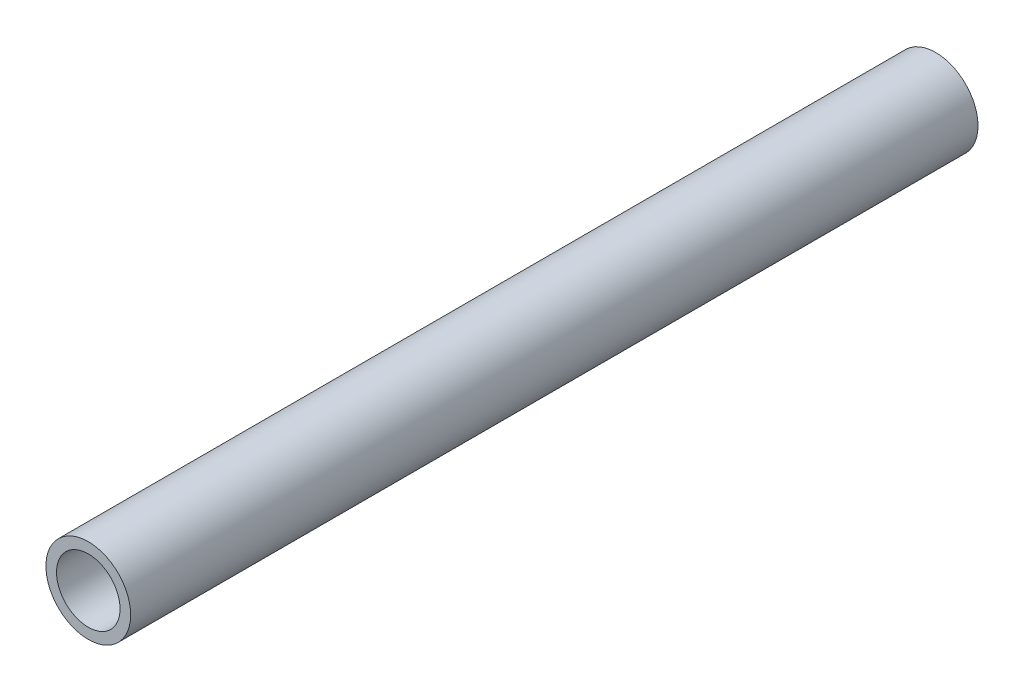
ISO-10303-21;
HEADER;
FILE_DESCRIPTION(('STEP AP214'),'2;1');
FILE_NAME('part.step','',(''),(''),'','','');
FILE_SCHEMA(('AUTOMOTIVE_DESIGN { 1 0 10303 214 1 1 1 1 }'));
ENDSEC;
DATA;
#1=APPLICATION_CONTEXT('core data for automotive mechanical design processes');
#2=APPLICATION_PROTOCOL_DEFINITION('international standard','automotive_design',2000,#1);
#3=PRODUCT_CONTEXT('',#1,'mechanical');
#4=PRODUCT('Part','Part','',(#3));
#5=PRODUCT_RELATED_PRODUCT_CATEGORY('part','',(#4));
#6=PRODUCT_DEFINITION_FORMATION('','',#4);
#7=PRODUCT_DEFINITION_CONTEXT('part definition',#1,'design');
#8=PRODUCT_DEFINITION('design','',#6,#7);
#9=PRODUCT_DEFINITION_SHAPE('','',#8);
#10=(LENGTH_UNIT() NAMED_UNIT(*) SI_UNIT(.MILLI.,.METRE.));
#11=(NAMED_UNIT(*) PLANE_ANGLE_UNIT() SI_UNIT($,.RADIAN.));
#12=(NAMED_UNIT(*) SI_UNIT($,.STERADIAN.) SOLID_ANGLE_UNIT());
#13=UNCERTAINTY_MEASURE_WITH_UNIT(LENGTH_MEASURE(1.E-05),#10,'distance_accuracy_value','');
#14=(GEOMETRIC_REPRESENTATION_CONTEXT(3) GLOBAL_UNCERTAINTY_ASSIGNED_CONTEXT((#13)) GLOBAL_UNIT_ASSIGNED_CONTEXT((#10,
#11,#12)) REPRESENTATION_CONTEXT('',''));
#15=CARTESIAN_POINT('',(0.,0.,0.));
#16=DIRECTION('',(0.,0.,1.));
#17=DIRECTION('',(1.,0.,0.));
#18=AXIS2_PLACEMENT_3D('',#15,#16,#17);
#19=CARTESIAN_POINT('',(0.,0.,160.));
#20=DIRECTION('',(0.,0.,1.));
#21=DIRECTION('',(1.,0.,0.));
#22=AXIS2_PLACEMENT_3D('',#19,#20,#21);
#23=PLANE('',#22);
#24=CARTESIAN_POINT('',(0.,0.,160.));
#25=DIRECTION('',(0.,0.,1.));
#26=DIRECTION('',(1.,0.,0.));
#27=AXIS2_PLACEMENT_3D('',#24,#25,#26);
#28=CIRCLE('',#27,8.);
#29=CARTESIAN_POINT('',(8.,0.,160.));
#30=VERTEX_POINT('',#29);
#31=EDGE_CURVE('E10',#30,#30,#28,.T.);
#32=ORIENTED_EDGE('',*,*,#31,.T.);
#33=EDGE_LOOP('',(#32));
#34=FACE_BOUND('',#33,.T.);
#35=CARTESIAN_POINT('',(0.,0.,160.));
#36=DIRECTION('',(0.,0.,1.));
#37=DIRECTION('',(1.,0.,0.));
#38=AXIS2_PLACEMENT_3D('',#35,#36,#37);
#39=CIRCLE('',#38,6.);
#40=CARTESIAN_POINT('',(6.,0.,160.));
#41=VERTEX_POINT('',#40);
#42=EDGE_CURVE('E47',#41,#41,#39,.T.);
#43=ORIENTED_EDGE('',*,*,#42,.F.);
#44=EDGE_LOOP('',(#43));
#45=FACE_BOUND('',#44,.T.);
#46=ADVANCED_FACE('F36',(#34,#45),#23,.T.);
#47=CARTESIAN_POINT('',(0.,0.,0.));
#48=DIRECTION('',(0.,0.,1.));
#49=DIRECTION('',(1.,0.,0.));
#50=AXIS2_PLACEMENT_3D('',#47,#48,#49);
#51=PLANE('',#50);
#52=CARTESIAN_POINT('',(0.,0.,0.));
#53=DIRECTION('',(0.,0.,1.));
#54=DIRECTION('',(1.,0.,0.));
#55=AXIS2_PLACEMENT_3D('',#52,#53,#54);
#56=CIRCLE('',#55,8.);
#57=CARTESIAN_POINT('',(8.,0.,0.));
#58=VERTEX_POINT('',#57);
#59=EDGE_CURVE('E40',#58,#58,#56,.T.);
#60=ORIENTED_EDGE('',*,*,#59,.F.);
#61=EDGE_LOOP('',(#60));
#62=FACE_BOUND('',#61,.T.);
#63=CARTESIAN_POINT('',(0.,0.,0.));
#64=DIRECTION('',(0.,0.,1.));
#65=DIRECTION('',(1.,0.,0.));
#66=AXIS2_PLACEMENT_3D('',#63,#64,#65);
#67=CIRCLE('',#66,6.);
#68=CARTESIAN_POINT('',(6.,0.,0.));
#69=VERTEX_POINT('',#68);
#70=EDGE_CURVE('E49',#69,#69,#67,.T.);
#71=ORIENTED_EDGE('',*,*,#70,.T.);
#72=EDGE_LOOP('',(#71));
#73=FACE_BOUND('',#72,.T.);
#74=ADVANCED_FACE('F59',(#62,#73),#51,.F.);
#75=CARTESIAN_POINT('',(0.,0.,160.));
#76=DIRECTION('',(0.,0.,-1.));
#77=DIRECTION('',(-1.,0.,0.));
#78=AXIS2_PLACEMENT_3D('',#75,#76,#77);
#79=CYLINDRICAL_SURFACE('',#78,8.);
#80=ORIENTED_EDGE('',*,*,#31,.F.);
#81=EDGE_LOOP('',(#80));
#82=FACE_BOUND('',#81,.T.);
#83=ORIENTED_EDGE('',*,*,#59,.T.);
#84=EDGE_LOOP('',(#83));
#85=FACE_BOUND('',#84,.T.);
#86=ADVANCED_FACE('F38',(#82,#85),#79,.T.);
#87=CARTESIAN_POINT('',(0.,0.,160.));
#88=DIRECTION('',(0.,0.,-1.));
#89=DIRECTION('',(-1.,0.,0.));
#90=AXIS2_PLACEMENT_3D('',#87,#88,#89);
#91=CYLINDRICAL_SURFACE('',#90,6.);
#92=ORIENTED_EDGE('',*,*,#42,.T.);
#93=EDGE_LOOP('',(#92));
#94=FACE_BOUND('',#93,.T.);
#95=ORIENTED_EDGE('',*,*,#70,.F.);
#96=EDGE_LOOP('',(#95));
#97=FACE_BOUND('',#96,.T.);
#98=ADVANCED_FACE('F55',(#94,#97),#91,.F.);
#99=CLOSED_SHELL('',(#46,#74,#86,#98));
#100=MANIFOLD_SOLID_BREP('B2',#99);
#101=ADVANCED_BREP_SHAPE_REPRESENTATION('',(#18,#100),#14);
#102=SHAPE_DEFINITION_REPRESENTATION(#9,#101);
ENDSEC;
END-ISO-10303-21;
